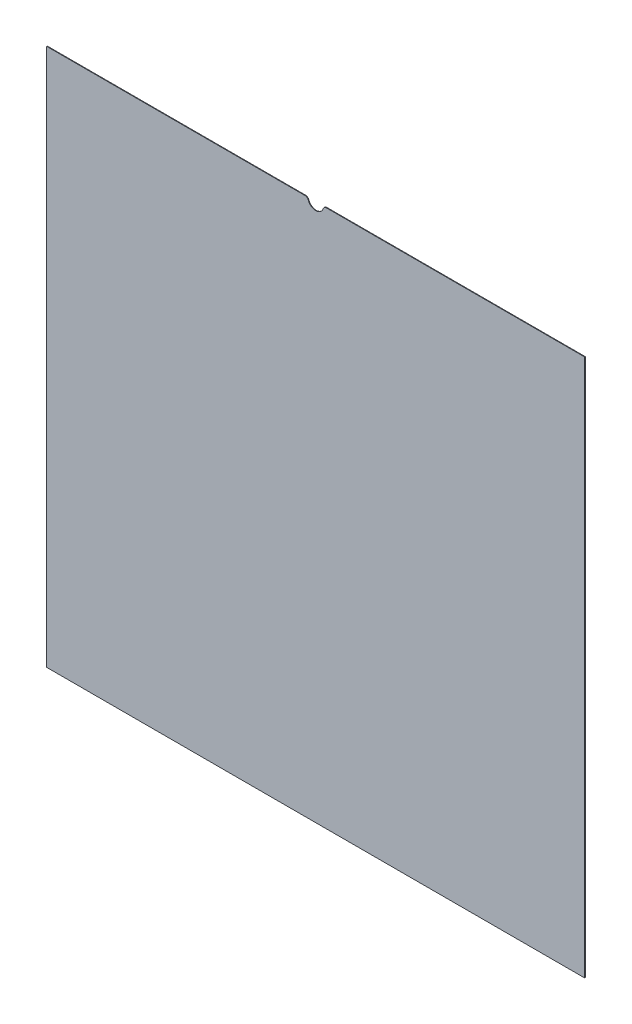
ISO-10303-21;
HEADER;
FILE_DESCRIPTION(('STEP AP214'),'2;1');
FILE_NAME('part.step','',(''),(''),'','','');
FILE_SCHEMA(('AUTOMOTIVE_DESIGN { 1 0 10303 214 1 1 1 1 }'));
ENDSEC;
DATA;
#1=APPLICATION_CONTEXT('core data for automotive mechanical design processes');
#2=APPLICATION_PROTOCOL_DEFINITION('international standard','automotive_design',2000,#1);
#3=PRODUCT_CONTEXT('',#1,'mechanical');
#4=PRODUCT('Part','Part','',(#3));
#5=PRODUCT_RELATED_PRODUCT_CATEGORY('part','',(#4));
#6=PRODUCT_DEFINITION_FORMATION('','',#4);
#7=PRODUCT_DEFINITION_CONTEXT('part definition',#1,'design');
#8=PRODUCT_DEFINITION('design','',#6,#7);
#9=PRODUCT_DEFINITION_SHAPE('','',#8);
#10=(LENGTH_UNIT() NAMED_UNIT(*) SI_UNIT(.MILLI.,.METRE.));
#11=(NAMED_UNIT(*) PLANE_ANGLE_UNIT() SI_UNIT($,.RADIAN.));
#12=(NAMED_UNIT(*) SI_UNIT($,.STERADIAN.) SOLID_ANGLE_UNIT());
#13=UNCERTAINTY_MEASURE_WITH_UNIT(LENGTH_MEASURE(1.E-05),#10,'distance_accuracy_value','');
#14=(GEOMETRIC_REPRESENTATION_CONTEXT(3) GLOBAL_UNCERTAINTY_ASSIGNED_CONTEXT((#13)) GLOBAL_UNIT_ASSIGNED_CONTEXT((#10,
#11,#12)) REPRESENTATION_CONTEXT('',''));
#15=CARTESIAN_POINT('',(0.,0.,0.));
#16=DIRECTION('',(0.,0.,1.));
#17=DIRECTION('',(1.,0.,0.));
#18=AXIS2_PLACEMENT_3D('',#15,#16,#17);
#19=CARTESIAN_POINT('',(301.0916,222.25,-6.4389));
#20=DIRECTION('',(0.,1.,0.));
#21=DIRECTION('',(0.,0.,1.));
#22=AXIS2_PLACEMENT_3D('',#19,#20,#21);
#23=PLANE('',#22);
#24=DIRECTION('',(1.,0.,0.));
#25=VECTOR('',#24,1.);
#26=CARTESIAN_POINT('',(-114.3,222.25,-0.254));
#27=LINE('',#26,#25);
#28=CARTESIAN_POINT('',(-114.3,222.25,-0.254));
#29=VERTEX_POINT('',#28);
#30=CARTESIAN_POINT('',(-4.6246139298324,222.25,-0.254));
#31=VERTEX_POINT('',#30);
#32=EDGE_CURVE('E107',#29,#31,#27,.T.);
#33=ORIENTED_EDGE('',*,*,#32,.F.);
#34=DIRECTION('',(0.,0.,1.));
#35=VECTOR('',#34,1.);
#36=CARTESIAN_POINT('',(-114.3,222.25,-44.45));
#37=LINE('',#36,#35);
#38=CARTESIAN_POINT('',(-114.3,222.25,0.));
#39=VERTEX_POINT('',#38);
#40=EDGE_CURVE('E117',#29,#39,#37,.T.);
#41=ORIENTED_EDGE('',*,*,#40,.T.);
#42=DIRECTION('',(1.,0.,0.));
#43=VECTOR('',#42,1.);
#44=CARTESIAN_POINT('',(-304.3555,222.25,0.));
#45=LINE('',#44,#43);
#46=CARTESIAN_POINT('',(-4.62461392983238,222.25,0.));
#47=VERTEX_POINT('',#46);
#48=EDGE_CURVE('E63',#39,#47,#45,.T.);
#49=ORIENTED_EDGE('',*,*,#48,.T.);
#50=DIRECTION('',(0.,0.,-1.));
#51=VECTOR('',#50,1.);
#52=CARTESIAN_POINT('',(-4.6246139298324,222.25,-3.2639));
#53=LINE('',#52,#51);
#54=EDGE_CURVE('E11',#47,#31,#53,.T.);
#55=ORIENTED_EDGE('',*,*,#54,.T.);
#56=EDGE_LOOP('',(#33,#41,#49,#55));
#57=FACE_BOUND('',#56,.T.);
#58=ADVANCED_FACE('F40',(#57),#23,.T.);
#59=CARTESIAN_POINT('',(4.6246139298324,222.25,-0.254));
#60=VERTEX_POINT('',#59);
#61=CARTESIAN_POINT('',(114.3,222.25,-0.254000000000004));
#62=VERTEX_POINT('',#61);
#63=EDGE_CURVE('E56',#60,#62,#27,.T.);
#64=ORIENTED_EDGE('',*,*,#63,.F.);
#65=DIRECTION('',(0.,0.,-1.));
#66=VECTOR('',#65,1.);
#67=CARTESIAN_POINT('',(4.6246139298324,222.25,0.));
#68=LINE('',#67,#66);
#69=CARTESIAN_POINT('',(4.62461392983238,222.25,0.));
#70=VERTEX_POINT('',#69);
#71=EDGE_CURVE('E156',#60,#70,#68,.F.);
#72=ORIENTED_EDGE('',*,*,#71,.T.);
#73=CARTESIAN_POINT('',(114.3,222.25,0.));
#74=VERTEX_POINT('',#73);
#75=EDGE_CURVE('E126',#70,#74,#45,.T.);
#76=ORIENTED_EDGE('',*,*,#75,.T.);
#77=DIRECTION('',(0.,0.,1.));
#78=VECTOR('',#77,1.);
#79=CARTESIAN_POINT('',(114.3,222.25,-44.45));
#80=LINE('',#79,#78);
#81=EDGE_CURVE('E141',#62,#74,#80,.T.);
#82=ORIENTED_EDGE('',*,*,#81,.F.);
#83=EDGE_LOOP('',(#64,#72,#76,#82));
#84=FACE_BOUND('',#83,.T.);
#85=ADVANCED_FACE('F217',(#84),#23,.T.);
#86=CARTESIAN_POINT('',(-304.3555,222.25,0.));
#87=DIRECTION('',(0.,0.,-1.));
#88=DIRECTION('',(-1.,0.,0.));
#89=AXIS2_PLACEMENT_3D('',#86,#87,#88);
#90=PLANE('',#89);
#91=ORIENTED_EDGE('',*,*,#48,.F.);
#92=DIRECTION('',(0.,1.,0.));
#93=VECTOR('',#92,1.);
#94=CARTESIAN_POINT('',(-114.3,222.25,0.));
#95=LINE('',#94,#93);
#96=CARTESIAN_POINT('',(-114.3,-6.26109999999997,0.));
#97=VERTEX_POINT('',#96);
#98=EDGE_CURVE('E124',#97,#39,#95,.T.);
#99=ORIENTED_EDGE('',*,*,#98,.F.);
#100=DIRECTION('',(-1.,0.,0.));
#101=VECTOR('',#100,1.);
#102=CARTESIAN_POINT('',(-114.3,-6.26109999999997,0.));
#103=LINE('',#102,#101);
#104=CARTESIAN_POINT('',(114.3,-6.26109999999997,0.));
#105=VERTEX_POINT('',#104);
#106=EDGE_CURVE('E188',#105,#97,#103,.T.);
#107=ORIENTED_EDGE('',*,*,#106,.F.);
#108=DIRECTION('',(0.,-1.,0.));
#109=VECTOR('',#108,1.);
#110=CARTESIAN_POINT('',(114.3,-6.26109999999997,0.));
#111=LINE('',#110,#109);
#112=EDGE_CURVE('E181',#74,#105,#111,.T.);
#113=ORIENTED_EDGE('',*,*,#112,.F.);
#114=ORIENTED_EDGE('',*,*,#75,.F.);
#115=CARTESIAN_POINT('',(4.6246139298324,220.6625,0.));
#116=DIRECTION('',(0.,0.,-1.));
#117=DIRECTION('',(-1.,0.,0.));
#118=AXIS2_PLACEMENT_3D('',#115,#116,#117);
#119=CIRCLE('',#118,1.5875);
#120=CARTESIAN_POINT('',(3.12311590066603,221.177922077922,0.));
#121=VERTEX_POINT('',#120);
#122=EDGE_CURVE('E49',#70,#121,#119,.F.);
#123=ORIENTED_EDGE('',*,*,#122,.T.);
#124=CARTESIAN_POINT('',(0.,222.25,0.));
#125=DIRECTION('',(0.,0.,-1.));
#126=DIRECTION('',(-1.,0.,0.));
#127=AXIS2_PLACEMENT_3D('',#124,#125,#126);
#128=CIRCLE('',#127,3.30199999999999);
#129=CARTESIAN_POINT('',(-3.12311590066603,221.177922077922,0.));
#130=VERTEX_POINT('',#129);
#131=EDGE_CURVE('E145',#121,#130,#128,.T.);
#132=ORIENTED_EDGE('',*,*,#131,.T.);
#133=CARTESIAN_POINT('',(-4.6246139298324,220.6625,0.));
#134=DIRECTION('',(0.,0.,-1.));
#135=DIRECTION('',(-1.,0.,0.));
#136=AXIS2_PLACEMENT_3D('',#133,#134,#135);
#137=CIRCLE('',#136,1.5875);
#138=EDGE_CURVE('E159',#130,#47,#137,.F.);
#139=ORIENTED_EDGE('',*,*,#138,.T.);
#140=EDGE_LOOP('',(#91,#99,#107,#113,#114,#123,#132,#139));
#141=FACE_BOUND('',#140,.T.);
#142=ADVANCED_FACE('F167',(#141),#90,.F.);
#143=CARTESIAN_POINT('',(0.,222.25,-44.45));
#144=DIRECTION('',(0.,0.,1.));
#145=DIRECTION('',(1.,0.,0.));
#146=AXIS2_PLACEMENT_3D('',#143,#144,#145);
#147=CYLINDRICAL_SURFACE('',#146,3.30199999999999);
#148=DIRECTION('',(0.,0.,1.));
#149=VECTOR('',#148,1.);
#150=CARTESIAN_POINT('',(3.12311590066603,221.177922077922,-44.45));
#151=LINE('',#150,#149);
#152=CARTESIAN_POINT('',(3.12311590066603,221.177922077922,-0.253999999999997));
#153=VERTEX_POINT('',#152);
#154=EDGE_CURVE('E152',#121,#153,#151,.F.);
#155=ORIENTED_EDGE('',*,*,#154,.T.);
#156=CARTESIAN_POINT('',(0.,222.25,-0.253999999999997));
#157=DIRECTION('',(0.,0.,1.));
#158=DIRECTION('',(0.,-1.,0.));
#159=AXIS2_PLACEMENT_3D('',#156,#157,#158);
#160=CIRCLE('',#159,3.30199999999999);
#161=CARTESIAN_POINT('',(-3.12311590066603,221.177922077922,-0.253999999999997));
#162=VERTEX_POINT('',#161);
#163=EDGE_CURVE('E182',#153,#162,#160,.F.);
#164=ORIENTED_EDGE('',*,*,#163,.T.);
#165=DIRECTION('',(0.,0.,1.));
#166=VECTOR('',#165,1.);
#167=CARTESIAN_POINT('',(-3.12311590066603,221.177922077922,-44.45));
#168=LINE('',#167,#166);
#169=EDGE_CURVE('E149',#162,#130,#168,.T.);
#170=ORIENTED_EDGE('',*,*,#169,.T.);
#171=ORIENTED_EDGE('',*,*,#131,.F.);
#172=EDGE_LOOP('',(#155,#164,#170,#171));
#173=FACE_BOUND('',#172,.T.);
#174=ADVANCED_FACE('F173',(#173),#147,.F.);
#175=CARTESIAN_POINT('',(4.6246139298324,220.6625,-44.45));
#176=DIRECTION('',(0.,0.,1.));
#177=DIRECTION('',(1.,0.,0.));
#178=AXIS2_PLACEMENT_3D('',#175,#176,#177);
#179=CYLINDRICAL_SURFACE('',#178,1.5875);
#180=CARTESIAN_POINT('',(4.6246139298324,220.6625,-0.253999999999997));
#181=DIRECTION('',(0.,0.,1.));
#182=DIRECTION('',(0.,-1.,0.));
#183=AXIS2_PLACEMENT_3D('',#180,#181,#182);
#184=CIRCLE('',#183,1.5875);
#185=EDGE_CURVE('E179',#153,#60,#184,.F.);
#186=ORIENTED_EDGE('',*,*,#185,.F.);
#187=ORIENTED_EDGE('',*,*,#154,.F.);
#188=ORIENTED_EDGE('',*,*,#122,.F.);
#189=ORIENTED_EDGE('',*,*,#71,.F.);
#190=EDGE_LOOP('',(#186,#187,#188,#189));
#191=FACE_BOUND('',#190,.T.);
#192=ADVANCED_FACE('F178',(#191),#179,.T.);
#193=CARTESIAN_POINT('',(-4.6246139298324,220.6625,-44.45));
#194=DIRECTION('',(0.,0.,1.));
#195=DIRECTION('',(1.,0.,0.));
#196=AXIS2_PLACEMENT_3D('',#193,#194,#195);
#197=CYLINDRICAL_SURFACE('',#196,1.5875);
#198=CARTESIAN_POINT('',(-4.6246139298324,220.6625,-0.253999999999997));
#199=DIRECTION('',(0.,0.,1.));
#200=DIRECTION('',(0.,-1.,0.));
#201=AXIS2_PLACEMENT_3D('',#198,#199,#200);
#202=CIRCLE('',#201,1.5875);
#203=EDGE_CURVE('E190',#31,#162,#202,.F.);
#204=ORIENTED_EDGE('',*,*,#203,.F.);
#205=ORIENTED_EDGE('',*,*,#54,.F.);
#206=ORIENTED_EDGE('',*,*,#138,.F.);
#207=ORIENTED_EDGE('',*,*,#169,.F.);
#208=EDGE_LOOP('',(#204,#205,#206,#207));
#209=FACE_BOUND('',#208,.T.);
#210=ADVANCED_FACE('F42',(#209),#197,.T.);
#211=CARTESIAN_POINT('',(-114.3,-6.26109999999997,-44.45));
#212=DIRECTION('',(0.,1.,0.));
#213=DIRECTION('',(0.,0.,1.));
#214=AXIS2_PLACEMENT_3D('',#211,#212,#213);
#215=PLANE('',#214);
#216=DIRECTION('',(0.,0.,1.));
#217=VECTOR('',#216,1.);
#218=CARTESIAN_POINT('',(-114.3,-6.26109999999997,-44.45));
#219=LINE('',#218,#217);
#220=CARTESIAN_POINT('',(-114.3,-6.26109999999995,-0.254000000000028));
#221=VERTEX_POINT('',#220);
#222=EDGE_CURVE('E127',#221,#97,#219,.T.);
#223=ORIENTED_EDGE('',*,*,#222,.F.);
#224=DIRECTION('',(1.,0.,0.));
#225=VECTOR('',#224,1.);
#226=CARTESIAN_POINT('',(-114.3,-6.26109999999995,-0.254000000000028));
#227=LINE('',#226,#225);
#228=CARTESIAN_POINT('',(114.3,-6.26109999999997,-0.254000000000028));
#229=VERTEX_POINT('',#228);
#230=EDGE_CURVE('E110',#221,#229,#227,.T.);
#231=ORIENTED_EDGE('',*,*,#230,.T.);
#232=DIRECTION('',(0.,0.,1.));
#233=VECTOR('',#232,1.);
#234=CARTESIAN_POINT('',(114.3,-6.26109999999997,-44.45));
#235=LINE('',#234,#233);
#236=EDGE_CURVE('E134',#229,#105,#235,.T.);
#237=ORIENTED_EDGE('',*,*,#236,.T.);
#238=ORIENTED_EDGE('',*,*,#106,.T.);
#239=EDGE_LOOP('',(#223,#231,#237,#238));
#240=FACE_BOUND('',#239,.T.);
#241=ADVANCED_FACE('F203',(#240),#215,.F.);
#242=CARTESIAN_POINT('',(-114.3,222.25,-44.45));
#243=DIRECTION('',(1.,0.,0.));
#244=DIRECTION('',(0.,1.,0.));
#245=AXIS2_PLACEMENT_3D('',#242,#243,#244);
#246=PLANE('',#245);
#247=ORIENTED_EDGE('',*,*,#40,.F.);
#248=DIRECTION('',(0.,-1.,0.));
#249=VECTOR('',#248,1.);
#250=CARTESIAN_POINT('',(-114.3,222.25,-0.254));
#251=LINE('',#250,#249);
#252=EDGE_CURVE('E104',#29,#221,#251,.T.);
#253=ORIENTED_EDGE('',*,*,#252,.T.);
#254=ORIENTED_EDGE('',*,*,#222,.T.);
#255=ORIENTED_EDGE('',*,*,#98,.T.);
#256=EDGE_LOOP('',(#247,#253,#254,#255));
#257=FACE_BOUND('',#256,.T.);
#258=ADVANCED_FACE('F122',(#257),#246,.F.);
#259=CARTESIAN_POINT('',(114.3,-6.26109999999997,-44.45));
#260=DIRECTION('',(-1.,0.,0.));
#261=DIRECTION('',(0.,-1.,0.));
#262=AXIS2_PLACEMENT_3D('',#259,#260,#261);
#263=PLANE('',#262);
#264=ORIENTED_EDGE('',*,*,#236,.F.);
#265=DIRECTION('',(0.,-1.,0.));
#266=VECTOR('',#265,1.);
#267=CARTESIAN_POINT('',(114.3,222.25,-0.254));
#268=LINE('',#267,#266);
#269=EDGE_CURVE('E115',#62,#229,#268,.T.);
#270=ORIENTED_EDGE('',*,*,#269,.F.);
#271=ORIENTED_EDGE('',*,*,#81,.T.);
#272=ORIENTED_EDGE('',*,*,#112,.T.);
#273=EDGE_LOOP('',(#264,#270,#271,#272));
#274=FACE_BOUND('',#273,.T.);
#275=ADVANCED_FACE('F215',(#274),#263,.F.);
#276=CARTESIAN_POINT('',(-114.3,222.25,-0.254));
#277=DIRECTION('',(0.,0.,1.));
#278=DIRECTION('',(0.,-1.,0.));
#279=AXIS2_PLACEMENT_3D('',#276,#277,#278);
#280=PLANE('',#279);
#281=ORIENTED_EDGE('',*,*,#185,.T.);
#282=ORIENTED_EDGE('',*,*,#63,.T.);
#283=ORIENTED_EDGE('',*,*,#269,.T.);
#284=ORIENTED_EDGE('',*,*,#230,.F.);
#285=ORIENTED_EDGE('',*,*,#252,.F.);
#286=ORIENTED_EDGE('',*,*,#32,.T.);
#287=ORIENTED_EDGE('',*,*,#203,.T.);
#288=ORIENTED_EDGE('',*,*,#163,.F.);
#289=EDGE_LOOP('',(#281,#282,#283,#284,#285,#286,#287,#288));
#290=FACE_BOUND('',#289,.T.);
#291=ADVANCED_FACE('F106',(#290),#280,.F.);
#292=CLOSED_SHELL('',(#58,#85,#142,#174,#192,#210,#241,#258,#275,#291));
#293=MANIFOLD_SOLID_BREP('B2',#292);
#294=ADVANCED_BREP_SHAPE_REPRESENTATION('',(#18,#293),#14);
#295=SHAPE_DEFINITION_REPRESENTATION(#9,#294);
ENDSEC;
END-ISO-10303-21;
